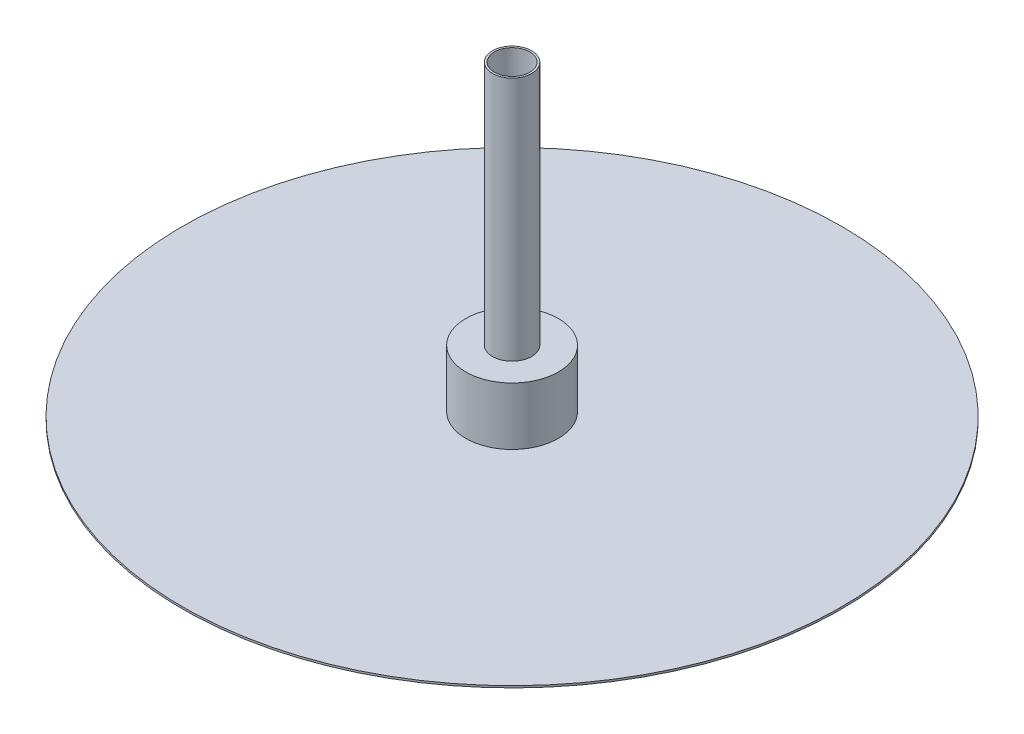
ISO-10303-21;
HEADER;
FILE_DESCRIPTION(('STEP AP214'),'2;1');
FILE_NAME('part.step','',(''),(''),'','','');
FILE_SCHEMA(('AUTOMOTIVE_DESIGN { 1 0 10303 214 1 1 1 1 }'));
ENDSEC;
DATA;
#1=APPLICATION_CONTEXT('core data for automotive mechanical design processes');
#2=APPLICATION_PROTOCOL_DEFINITION('international standard','automotive_design',2000,#1);
#3=PRODUCT_CONTEXT('',#1,'mechanical');
#4=PRODUCT('Part','Part','',(#3));
#5=PRODUCT_RELATED_PRODUCT_CATEGORY('part','',(#4));
#6=PRODUCT_DEFINITION_FORMATION('','',#4);
#7=PRODUCT_DEFINITION_CONTEXT('part definition',#1,'design');
#8=PRODUCT_DEFINITION('design','',#6,#7);
#9=PRODUCT_DEFINITION_SHAPE('','',#8);
#10=(LENGTH_UNIT() NAMED_UNIT(*) SI_UNIT(.MILLI.,.METRE.));
#11=(NAMED_UNIT(*) PLANE_ANGLE_UNIT() SI_UNIT($,.RADIAN.));
#12=(NAMED_UNIT(*) SI_UNIT($,.STERADIAN.) SOLID_ANGLE_UNIT());
#13=UNCERTAINTY_MEASURE_WITH_UNIT(LENGTH_MEASURE(1.E-05),#10,'distance_accuracy_value','');
#14=(GEOMETRIC_REPRESENTATION_CONTEXT(3) GLOBAL_UNCERTAINTY_ASSIGNED_CONTEXT((#13)) GLOBAL_UNIT_ASSIGNED_CONTEXT((#10,
#11,#12)) REPRESENTATION_CONTEXT('',''));
#15=CARTESIAN_POINT('',(0.,0.,0.));
#16=DIRECTION('',(0.,0.,1.));
#17=DIRECTION('',(1.,0.,0.));
#18=AXIS2_PLACEMENT_3D('',#15,#16,#17);
#19=CARTESIAN_POINT('',(0.,2.14988463486326E-11,0.));
#20=DIRECTION('',(0.,1.,0.));
#21=DIRECTION('',(0.,0.,1.));
#22=AXIS2_PLACEMENT_3D('',#19,#20,#21);
#23=PLANE('',#22);
#24=CARTESIAN_POINT('',(0.,2.14988463486326E-11,0.));
#25=DIRECTION('',(0.,-1.,0.));
#26=DIRECTION('',(0.,0.,-1.));
#27=AXIS2_PLACEMENT_3D('',#24,#25,#26);
#28=CIRCLE('',#27,33.3375000000001);
#29=CARTESIAN_POINT('',(0.,2.14988463486326E-11,-33.3375000000001));
#30=VERTEX_POINT('',#29);
#31=EDGE_CURVE('E11',#30,#30,#28,.T.);
#32=ORIENTED_EDGE('',*,*,#31,.F.);
#33=EDGE_LOOP('',(#32));
#34=FACE_BOUND('',#33,.T.);
#35=CARTESIAN_POINT('',(0.,2.14988463486326E-11,0.));
#36=DIRECTION('',(0.,-1.,0.));
#37=DIRECTION('',(0.,0.,-1.));
#38=AXIS2_PLACEMENT_3D('',#35,#36,#37);
#39=CIRCLE('',#38,533.337499999988);
#40=CARTESIAN_POINT('',(0.,2.14988463486326E-11,-533.337499999988));
#41=VERTEX_POINT('',#40);
#42=EDGE_CURVE('E84',#41,#41,#39,.T.);
#43=ORIENTED_EDGE('',*,*,#42,.T.);
#44=EDGE_LOOP('',(#43));
#45=FACE_BOUND('',#44,.T.);
#46=ADVANCED_FACE('F44',(#34,#45),#23,.F.);
#47=CARTESIAN_POINT('',(0.,0.,0.));
#48=DIRECTION('',(0.,-1.,0.));
#49=DIRECTION('',(0.,0.,-1.));
#50=AXIS2_PLACEMENT_3D('',#47,#48,#49);
#51=CYLINDRICAL_SURFACE('',#50,33.3375000000001);
#52=CARTESIAN_POINT('',(0.,96.8250000000215,0.));
#53=DIRECTION('',(0.,-1.,0.));
#54=DIRECTION('',(0.,0.,-1.));
#55=AXIS2_PLACEMENT_3D('',#52,#53,#54);
#56=CIRCLE('',#55,33.3375000000001);
#57=CARTESIAN_POINT('',(0.,96.8250000000215,-33.3375000000001));
#58=VERTEX_POINT('',#57);
#59=EDGE_CURVE('E50',#58,#58,#56,.T.);
#60=ORIENTED_EDGE('',*,*,#59,.F.);
#61=EDGE_LOOP('',(#60));
#62=FACE_BOUND('',#61,.T.);
#63=ORIENTED_EDGE('',*,*,#31,.T.);
#64=EDGE_LOOP('',(#63));
#65=FACE_BOUND('',#64,.T.);
#66=ADVANCED_FACE('F115',(#62,#65),#51,.F.);
#67=CARTESIAN_POINT('',(0.,96.8250000000215,0.));
#68=DIRECTION('',(0.,-1.,0.));
#69=DIRECTION('',(0.,0.,-1.));
#70=AXIS2_PLACEMENT_3D('',#67,#68,#69);
#71=PLANE('',#70);
#72=CARTESIAN_POINT('',(0.,96.8250000000215,0.));
#73=DIRECTION('',(0.,-1.,0.));
#74=DIRECTION('',(0.,0.,-1.));
#75=AXIS2_PLACEMENT_3D('',#72,#73,#74);
#76=CIRCLE('',#75,36.5125000000001);
#77=CARTESIAN_POINT('',(0.,96.8250000000215,-36.5125000000001));
#78=VERTEX_POINT('',#77);
#79=EDGE_CURVE('E54',#78,#78,#76,.T.);
#80=ORIENTED_EDGE('',*,*,#79,.F.);
#81=EDGE_LOOP('',(#80));
#82=FACE_BOUND('',#81,.T.);
#83=ORIENTED_EDGE('',*,*,#59,.T.);
#84=EDGE_LOOP('',(#83));
#85=FACE_BOUND('',#84,.T.);
#86=ADVANCED_FACE('F108',(#82,#85),#71,.F.);
#87=CARTESIAN_POINT('',(0.,0.,0.));
#88=DIRECTION('',(0.,-1.,0.));
#89=DIRECTION('',(0.,0.,-1.));
#90=AXIS2_PLACEMENT_3D('',#87,#88,#89);
#91=CYLINDRICAL_SURFACE('',#90,36.5125000000001);
#92=ORIENTED_EDGE('',*,*,#79,.T.);
#93=EDGE_LOOP('',(#92));
#94=FACE_BOUND('',#93,.T.);
#95=CARTESIAN_POINT('',(0.,13.1750000000215,0.));
#96=DIRECTION('',(0.,-1.,0.));
#97=DIRECTION('',(0.,0.,-1.));
#98=AXIS2_PLACEMENT_3D('',#95,#96,#97);
#99=CIRCLE('',#98,36.5125000000001);
#100=CARTESIAN_POINT('',(0.,13.1750000000215,-36.5125000000001));
#101=VERTEX_POINT('',#100);
#102=EDGE_CURVE('E58',#101,#101,#99,.T.);
#103=ORIENTED_EDGE('',*,*,#102,.F.);
#104=EDGE_LOOP('',(#103));
#105=FACE_BOUND('',#104,.T.);
#106=ADVANCED_FACE('F101',(#94,#105),#91,.T.);
#107=CARTESIAN_POINT('',(0.,13.1750000000215,0.));
#108=DIRECTION('',(0.,-1.,0.));
#109=DIRECTION('',(0.,0.,-1.));
#110=AXIS2_PLACEMENT_3D('',#107,#108,#109);
#111=PLANE('',#110);
#112=CARTESIAN_POINT('',(-45.,13.1750000000215,0.));
#113=DIRECTION('',(0.,1.,0.));
#114=DIRECTION('',(0.,0.,1.));
#115=AXIS2_PLACEMENT_3D('',#112,#113,#114);
#116=CIRCLE('',#115,2.5);
#117=CARTESIAN_POINT('',(-45.,13.1750000000215,2.5));
#118=VERTEX_POINT('',#117);
#119=EDGE_CURVE('E90',#118,#118,#116,.T.);
#120=ORIENTED_EDGE('',*,*,#119,.F.);
#121=EDGE_LOOP('',(#120));
#122=FACE_BOUND('',#121,.T.);
#123=CARTESIAN_POINT('',(0.,13.1750000000215,0.));
#124=DIRECTION('',(0.,-1.,0.));
#125=DIRECTION('',(0.,0.,-1.));
#126=AXIS2_PLACEMENT_3D('',#123,#124,#125);
#127=CIRCLE('',#126,57.9556312362567);
#128=CARTESIAN_POINT('',(0.,13.1750000000215,-57.9556312362567));
#129=VERTEX_POINT('',#128);
#130=EDGE_CURVE('E63',#129,#129,#127,.T.);
#131=ORIENTED_EDGE('',*,*,#130,.F.);
#132=EDGE_LOOP('',(#131));
#133=FACE_BOUND('',#132,.T.);
#134=ORIENTED_EDGE('',*,*,#102,.T.);
#135=EDGE_LOOP('',(#134));
#136=FACE_BOUND('',#135,.T.);
#137=ADVANCED_FACE('F97',(#122,#133,#136),#111,.F.);
#138=CARTESIAN_POINT('',(0.,0.,0.));
#139=DIRECTION('',(0.,-1.,0.));
#140=DIRECTION('',(0.,0.,-1.));
#141=AXIS2_PLACEMENT_3D('',#138,#139,#140);
#142=CYLINDRICAL_SURFACE('',#141,57.9556312362567);
#143=CARTESIAN_POINT('',(0.,80.0000000000215,0.));
#144=DIRECTION('',(0.,-1.,0.));
#145=DIRECTION('',(0.,0.,-1.));
#146=AXIS2_PLACEMENT_3D('',#143,#144,#145);
#147=CIRCLE('',#146,57.9556312362567);
#148=CARTESIAN_POINT('',(0.,80.0000000000215,-57.9556312362567));
#149=VERTEX_POINT('',#148);
#150=EDGE_CURVE('E66',#149,#149,#147,.T.);
#151=ORIENTED_EDGE('',*,*,#150,.F.);
#152=EDGE_LOOP('',(#151));
#153=FACE_BOUND('',#152,.T.);
#154=ORIENTED_EDGE('',*,*,#130,.T.);
#155=EDGE_LOOP('',(#154));
#156=FACE_BOUND('',#155,.T.);
#157=ADVANCED_FACE('F100',(#153,#156),#142,.F.);
#158=CARTESIAN_POINT('',(0.,80.0000000000215,0.));
#159=DIRECTION('',(0.,1.,0.));
#160=DIRECTION('',(0.,0.,1.));
#161=AXIS2_PLACEMENT_3D('',#158,#159,#160);
#162=PLANE('',#161);
#163=ORIENTED_EDGE('',*,*,#150,.T.);
#164=EDGE_LOOP('',(#163));
#165=FACE_BOUND('',#164,.T.);
#166=CARTESIAN_POINT('',(0.,80.0000000000215,0.));
#167=DIRECTION('',(0.,-1.,0.));
#168=DIRECTION('',(0.,0.,-1.));
#169=AXIS2_PLACEMENT_3D('',#166,#167,#168);
#170=CIRCLE('',#169,61.1306312362567);
#171=CARTESIAN_POINT('',(0.,80.0000000000215,-61.1306312362567));
#172=VERTEX_POINT('',#171);
#173=EDGE_CURVE('E69',#172,#172,#170,.T.);
#174=ORIENTED_EDGE('',*,*,#173,.F.);
#175=EDGE_LOOP('',(#174));
#176=FACE_BOUND('',#175,.T.);
#177=ADVANCED_FACE('F169',(#165,#176),#162,.T.);
#178=CARTESIAN_POINT('',(0.,0.,0.));
#179=DIRECTION('',(0.,-1.,0.));
#180=DIRECTION('',(0.,0.,-1.));
#181=AXIS2_PLACEMENT_3D('',#178,#179,#180);
#182=CYLINDRICAL_SURFACE('',#181,61.1306312362567);
#183=ORIENTED_EDGE('',*,*,#173,.T.);
#184=EDGE_LOOP('',(#183));
#185=FACE_BOUND('',#184,.T.);
#186=CARTESIAN_POINT('',(0.,10.0000000000215,0.));
#187=DIRECTION('',(0.,-1.,0.));
#188=DIRECTION('',(0.,0.,-1.));
#189=AXIS2_PLACEMENT_3D('',#186,#187,#188);
#190=CIRCLE('',#189,61.1306312362567);
#191=CARTESIAN_POINT('',(0.,10.0000000000215,-61.1306312362567));
#192=VERTEX_POINT('',#191);
#193=EDGE_CURVE('E72',#192,#192,#190,.T.);
#194=ORIENTED_EDGE('',*,*,#193,.F.);
#195=EDGE_LOOP('',(#194));
#196=FACE_BOUND('',#195,.T.);
#197=ADVANCED_FACE('F161',(#185,#196),#182,.T.);
#198=CARTESIAN_POINT('',(0.,10.0000000000215,0.));
#199=DIRECTION('',(0.,-1.,0.));
#200=DIRECTION('',(0.,0.,-1.));
#201=AXIS2_PLACEMENT_3D('',#198,#199,#200);
#202=PLANE('',#201);
#203=CARTESIAN_POINT('',(-45.,10.0000000000215,0.));
#204=DIRECTION('',(0.,-1.,0.));
#205=DIRECTION('',(0.,0.,-1.));
#206=AXIS2_PLACEMENT_3D('',#203,#204,#205);
#207=CIRCLE('',#206,2.5);
#208=CARTESIAN_POINT('',(-45.,10.0000000000215,-2.5));
#209=VERTEX_POINT('',#208);
#210=EDGE_CURVE('E87',#209,#209,#207,.F.);
#211=ORIENTED_EDGE('',*,*,#210,.T.);
#212=EDGE_LOOP('',(#211));
#213=FACE_BOUND('',#212,.T.);
#214=ORIENTED_EDGE('',*,*,#193,.T.);
#215=EDGE_LOOP('',(#214));
#216=FACE_BOUND('',#215,.T.);
#217=CARTESIAN_POINT('',(0.,10.0000000000215,0.));
#218=DIRECTION('',(0.,-1.,0.));
#219=DIRECTION('',(0.,0.,-1.));
#220=AXIS2_PLACEMENT_3D('',#217,#218,#219);
#221=CIRCLE('',#220,36.5125000000001);
#222=CARTESIAN_POINT('',(0.,10.0000000000215,-36.5125000000001));
#223=VERTEX_POINT('',#222);
#224=EDGE_CURVE('E75',#223,#223,#221,.T.);
#225=ORIENTED_EDGE('',*,*,#224,.F.);
#226=EDGE_LOOP('',(#225));
#227=FACE_BOUND('',#226,.T.);
#228=ADVANCED_FACE('F122',(#213,#216,#227),#202,.T.);
#229=ORIENTED_EDGE('',*,*,#224,.T.);
#230=EDGE_LOOP('',(#229));
#231=FACE_BOUND('',#230,.T.);
#232=CARTESIAN_POINT('',(0.,3.1750000000215,0.));
#233=DIRECTION('',(0.,-1.,0.));
#234=DIRECTION('',(0.,0.,-1.));
#235=AXIS2_PLACEMENT_3D('',#232,#233,#234);
#236=CIRCLE('',#235,36.5125000000001);
#237=CARTESIAN_POINT('',(0.,3.1750000000215,-36.5125000000001));
#238=VERTEX_POINT('',#237);
#239=EDGE_CURVE('E78',#238,#238,#236,.T.);
#240=ORIENTED_EDGE('',*,*,#239,.F.);
#241=EDGE_LOOP('',(#240));
#242=FACE_BOUND('',#241,.T.);
#243=ADVANCED_FACE('F111',(#231,#242),#91,.T.);
#244=CARTESIAN_POINT('',(0.,3.1750000000215,0.));
#245=DIRECTION('',(0.,1.,0.));
#246=DIRECTION('',(0.,0.,1.));
#247=AXIS2_PLACEMENT_3D('',#244,#245,#246);
#248=PLANE('',#247);
#249=ORIENTED_EDGE('',*,*,#239,.T.);
#250=EDGE_LOOP('',(#249));
#251=FACE_BOUND('',#250,.T.);
#252=CARTESIAN_POINT('',(0.,3.1750000000215,0.));
#253=DIRECTION('',(0.,-1.,0.));
#254=DIRECTION('',(0.,0.,-1.));
#255=AXIS2_PLACEMENT_3D('',#252,#253,#254);
#256=CIRCLE('',#255,533.3375);
#257=CARTESIAN_POINT('',(0.,3.1750000000215,-533.3375));
#258=VERTEX_POINT('',#257);
#259=EDGE_CURVE('E81',#258,#258,#256,.T.);
#260=ORIENTED_EDGE('',*,*,#259,.F.);
#261=EDGE_LOOP('',(#260));
#262=FACE_BOUND('',#261,.T.);
#263=ADVANCED_FACE('F121',(#251,#262),#248,.T.);
#264=CARTESIAN_POINT('',(0.,0.,0.));
#265=DIRECTION('',(0.,-1.,0.));
#266=DIRECTION('',(0.,0.,-1.));
#267=AXIS2_PLACEMENT_3D('',#264,#265,#266);
#268=CYLINDRICAL_SURFACE('',#267,533.337499999994);
#269=ORIENTED_EDGE('',*,*,#259,.T.);
#270=EDGE_LOOP('',(#269));
#271=FACE_BOUND('',#270,.T.);
#272=ORIENTED_EDGE('',*,*,#42,.F.);
#273=EDGE_LOOP('',(#272));
#274=FACE_BOUND('',#273,.T.);
#275=ADVANCED_FACE('F133',(#271,#274),#268,.T.);
#276=CARTESIAN_POINT('',(-45.,2.92893218815601,0.));
#277=DIRECTION('',(0.,1.,0.));
#278=DIRECTION('',(0.,0.,1.));
#279=AXIS2_PLACEMENT_3D('',#276,#277,#278);
#280=CYLINDRICAL_SURFACE('',#279,2.5);
#281=ORIENTED_EDGE('',*,*,#119,.T.);
#282=EDGE_LOOP('',(#281));
#283=FACE_BOUND('',#282,.T.);
#284=ORIENTED_EDGE('',*,*,#210,.F.);
#285=EDGE_LOOP('',(#284));
#286=FACE_BOUND('',#285,.T.);
#287=ADVANCED_FACE('F94',(#283,#286),#280,.F.);
#288=CLOSED_SHELL('',(#46,#66,#86,#106,#137,#157,#177,#197,#228,#243,#263,#275,#287));
#289=MANIFOLD_SOLID_BREP('B2',#288);
#290=CARTESIAN_POINT('',(0.,10.0000000000215,0.));
#291=DIRECTION('',(0.,-1.,0.));
#292=DIRECTION('',(0.,0.,-1.));
#293=AXIS2_PLACEMENT_3D('',#290,#291,#292);
#294=PLANE('',#293);
#295=CARTESIAN_POINT('',(0.,10.0000000000215,0.));
#296=DIRECTION('',(0.,-1.,0.));
#297=DIRECTION('',(0.,0.,-1.));
#298=AXIS2_PLACEMENT_3D('',#295,#296,#297);
#299=CIRCLE('',#298,74.925);
#300=CARTESIAN_POINT('',(0.,10.0000000000215,-74.925));
#301=VERTEX_POINT('',#300);
#302=EDGE_CURVE('E288',#301,#301,#299,.T.);
#303=ORIENTED_EDGE('',*,*,#302,.T.);
#304=EDGE_LOOP('',(#303));
#305=FACE_BOUND('',#304,.T.);
#306=CARTESIAN_POINT('',(0.,10.0000000000215,0.));
#307=DIRECTION('',(0.,-1.,0.));
#308=DIRECTION('',(0.,0.,-1.));
#309=AXIS2_PLACEMENT_3D('',#306,#307,#308);
#310=CIRCLE('',#309,71.75);
#311=CARTESIAN_POINT('',(0.,10.0000000000215,-71.75));
#312=VERTEX_POINT('',#311);
#313=EDGE_CURVE('E293',#312,#312,#310,.T.);
#314=ORIENTED_EDGE('',*,*,#313,.F.);
#315=EDGE_LOOP('',(#314));
#316=FACE_BOUND('',#315,.T.);
#317=ADVANCED_FACE('F280',(#305,#316),#294,.T.);
#318=CARTESIAN_POINT('',(0.,0.,0.));
#319=DIRECTION('',(0.,-1.,0.));
#320=DIRECTION('',(0.,0.,-1.));
#321=AXIS2_PLACEMENT_3D('',#318,#319,#320);
#322=CYLINDRICAL_SURFACE('',#321,74.925);
#323=CARTESIAN_POINT('',(0.,103.175000000021,0.));
#324=DIRECTION('',(0.,-1.,0.));
#325=DIRECTION('',(0.,0.,-1.));
#326=AXIS2_PLACEMENT_3D('',#323,#324,#325);
#327=CIRCLE('',#326,74.925);
#328=CARTESIAN_POINT('',(0.,103.175000000021,-74.925));
#329=VERTEX_POINT('',#328);
#330=EDGE_CURVE('E43',#329,#329,#327,.T.);
#331=ORIENTED_EDGE('',*,*,#330,.T.);
#332=EDGE_LOOP('',(#331));
#333=FACE_BOUND('',#332,.T.);
#334=ORIENTED_EDGE('',*,*,#302,.F.);
#335=EDGE_LOOP('',(#334));
#336=FACE_BOUND('',#335,.T.);
#337=ADVANCED_FACE('F331',(#333,#336),#322,.T.);
#338=CARTESIAN_POINT('',(0.,103.175000000021,0.));
#339=DIRECTION('',(0.,1.,0.));
#340=DIRECTION('',(0.,0.,1.));
#341=AXIS2_PLACEMENT_3D('',#338,#339,#340);
#342=PLANE('',#341);
#343=CARTESIAN_POINT('',(0.,103.175000000021,0.));
#344=DIRECTION('',(0.,-1.,0.));
#345=DIRECTION('',(0.,0.,-1.));
#346=AXIS2_PLACEMENT_3D('',#343,#344,#345);
#347=CIRCLE('',#346,31.75);
#348=CARTESIAN_POINT('',(0.,103.175000000021,-31.75));
#349=VERTEX_POINT('',#348);
#350=EDGE_CURVE('E302',#349,#349,#347,.T.);
#351=ORIENTED_EDGE('',*,*,#350,.T.);
#352=EDGE_LOOP('',(#351));
#353=FACE_BOUND('',#352,.T.);
#354=ORIENTED_EDGE('',*,*,#330,.F.);
#355=EDGE_LOOP('',(#354));
#356=FACE_BOUND('',#355,.T.);
#357=ADVANCED_FACE('F337',(#353,#356),#342,.T.);
#358=CARTESIAN_POINT('',(0.,0.,0.));
#359=DIRECTION('',(0.,-1.,0.));
#360=DIRECTION('',(0.,0.,-1.));
#361=AXIS2_PLACEMENT_3D('',#358,#359,#360);
#362=CYLINDRICAL_SURFACE('',#361,71.75);
#363=ORIENTED_EDGE('',*,*,#313,.T.);
#364=EDGE_LOOP('',(#363));
#365=FACE_BOUND('',#364,.T.);
#366=CARTESIAN_POINT('',(0.,100.000000000022,0.));
#367=DIRECTION('',(0.,-1.,0.));
#368=DIRECTION('',(0.,0.,-1.));
#369=AXIS2_PLACEMENT_3D('',#366,#367,#368);
#370=CIRCLE('',#369,71.75);
#371=CARTESIAN_POINT('',(0.,100.000000000022,-71.75));
#372=VERTEX_POINT('',#371);
#373=EDGE_CURVE('E355',#372,#372,#370,.T.);
#374=ORIENTED_EDGE('',*,*,#373,.F.);
#375=EDGE_LOOP('',(#374));
#376=FACE_BOUND('',#375,.T.);
#377=ADVANCED_FACE('F323',(#365,#376),#362,.F.);
#378=CARTESIAN_POINT('',(0.,100.000000000022,0.));
#379=DIRECTION('',(0.,-1.,0.));
#380=DIRECTION('',(0.,0.,-1.));
#381=AXIS2_PLACEMENT_3D('',#378,#379,#380);
#382=PLANE('',#381);
#383=ORIENTED_EDGE('',*,*,#373,.T.);
#384=EDGE_LOOP('',(#383));
#385=FACE_BOUND('',#384,.T.);
#386=CARTESIAN_POINT('',(0.,100.000000000022,0.));
#387=DIRECTION('',(0.,-1.,0.));
#388=DIRECTION('',(0.,0.,-1.));
#389=AXIS2_PLACEMENT_3D('',#386,#387,#388);
#390=CIRCLE('',#389,31.75);
#391=CARTESIAN_POINT('',(0.,100.000000000022,-31.75));
#392=VERTEX_POINT('',#391);
#393=EDGE_CURVE('E352',#392,#392,#390,.T.);
#394=ORIENTED_EDGE('',*,*,#393,.F.);
#395=EDGE_LOOP('',(#394));
#396=FACE_BOUND('',#395,.T.);
#397=ADVANCED_FACE('F314',(#385,#396),#382,.T.);
#398=CARTESIAN_POINT('',(0.,0.,0.));
#399=DIRECTION('',(0.,-1.,0.));
#400=DIRECTION('',(0.,0.,-1.));
#401=AXIS2_PLACEMENT_3D('',#398,#399,#400);
#402=CYLINDRICAL_SURFACE('',#401,28.575);
#403=CARTESIAN_POINT('',(0.,-100.,0.));
#404=DIRECTION('',(0.,-1.,0.));
#405=DIRECTION('',(0.,0.,-1.));
#406=AXIS2_PLACEMENT_3D('',#403,#404,#405);
#407=CIRCLE('',#406,28.575);
#408=CARTESIAN_POINT('',(0.,-100.,-28.575));
#409=VERTEX_POINT('',#408);
#410=EDGE_CURVE('E297',#409,#409,#407,.T.);
#411=ORIENTED_EDGE('',*,*,#410,.T.);
#412=EDGE_LOOP('',(#411));
#413=FACE_BOUND('',#412,.T.);
#414=CARTESIAN_POINT('',(0.,500.,0.));
#415=DIRECTION('',(0.,-1.,0.));
#416=DIRECTION('',(0.,0.,-1.));
#417=AXIS2_PLACEMENT_3D('',#414,#415,#416);
#418=CIRCLE('',#417,28.5750000000001);
#419=CARTESIAN_POINT('',(0.,500.,-28.5750000000001));
#420=VERTEX_POINT('',#419);
#421=EDGE_CURVE('E284',#420,#420,#418,.T.);
#422=ORIENTED_EDGE('',*,*,#421,.F.);
#423=EDGE_LOOP('',(#422));
#424=FACE_BOUND('',#423,.T.);
#425=ADVANCED_FACE('F312',(#413,#424),#402,.F.);
#426=CARTESIAN_POINT('',(-31.7500000000001,500.,0.));
#427=DIRECTION('',(0.,1.,0.));
#428=DIRECTION('',(0.,0.,1.));
#429=AXIS2_PLACEMENT_3D('',#426,#427,#428);
#430=PLANE('',#429);
#431=ORIENTED_EDGE('',*,*,#421,.T.);
#432=EDGE_LOOP('',(#431));
#433=FACE_BOUND('',#432,.T.);
#434=CARTESIAN_POINT('',(0.,500.,0.));
#435=DIRECTION('',(0.,-1.,0.));
#436=DIRECTION('',(0.,0.,-1.));
#437=AXIS2_PLACEMENT_3D('',#434,#435,#436);
#438=CIRCLE('',#437,31.7500000000001);
#439=CARTESIAN_POINT('',(0.,500.,-31.7500000000001));
#440=VERTEX_POINT('',#439);
#441=EDGE_CURVE('E303',#440,#440,#438,.T.);
#442=ORIENTED_EDGE('',*,*,#441,.F.);
#443=EDGE_LOOP('',(#442));
#444=FACE_BOUND('',#443,.T.);
#445=ADVANCED_FACE('F282',(#433,#444),#430,.T.);
#446=CARTESIAN_POINT('',(0.,0.,0.));
#447=DIRECTION('',(0.,-1.,0.));
#448=DIRECTION('',(0.,0.,-1.));
#449=AXIS2_PLACEMENT_3D('',#446,#447,#448);
#450=CYLINDRICAL_SURFACE('',#449,31.75);
#451=ORIENTED_EDGE('',*,*,#350,.F.);
#452=EDGE_LOOP('',(#451));
#453=FACE_BOUND('',#452,.T.);
#454=ORIENTED_EDGE('',*,*,#441,.T.);
#455=EDGE_LOOP('',(#454));
#456=FACE_BOUND('',#455,.T.);
#457=ADVANCED_FACE('F322',(#453,#456),#450,.T.);
#458=CARTESIAN_POINT('',(0.,-100.,0.));
#459=DIRECTION('',(0.,1.,0.));
#460=DIRECTION('',(0.,0.,1.));
#461=AXIS2_PLACEMENT_3D('',#458,#459,#460);
#462=PLANE('',#461);
#463=ORIENTED_EDGE('',*,*,#410,.F.);
#464=EDGE_LOOP('',(#463));
#465=FACE_BOUND('',#464,.T.);
#466=CARTESIAN_POINT('',(0.,-100.,0.));
#467=DIRECTION('',(0.,-1.,0.));
#468=DIRECTION('',(0.,0.,-1.));
#469=AXIS2_PLACEMENT_3D('',#466,#467,#468);
#470=CIRCLE('',#469,31.75);
#471=CARTESIAN_POINT('',(0.,-100.,-31.75));
#472=VERTEX_POINT('',#471);
#473=EDGE_CURVE('E300',#472,#472,#470,.T.);
#474=ORIENTED_EDGE('',*,*,#473,.T.);
#475=EDGE_LOOP('',(#474));
#476=FACE_BOUND('',#475,.T.);
#477=ADVANCED_FACE('F317',(#465,#476),#462,.F.);
#478=ORIENTED_EDGE('',*,*,#393,.T.);
#479=EDGE_LOOP('',(#478));
#480=FACE_BOUND('',#479,.T.);
#481=ORIENTED_EDGE('',*,*,#473,.F.);
#482=EDGE_LOOP('',(#481));
#483=FACE_BOUND('',#482,.T.);
#484=ADVANCED_FACE('F326',(#480,#483),#450,.T.);
#485=CLOSED_SHELL('',(#317,#337,#357,#377,#397,#425,#445,#457,#477,#484));
#486=MANIFOLD_SOLID_BREP('B6',#485);
#487=ADVANCED_BREP_SHAPE_REPRESENTATION('',(#18,#289,#486),#14);
#488=SHAPE_DEFINITION_REPRESENTATION(#9,#487);
ENDSEC;
END-ISO-10303-21;
